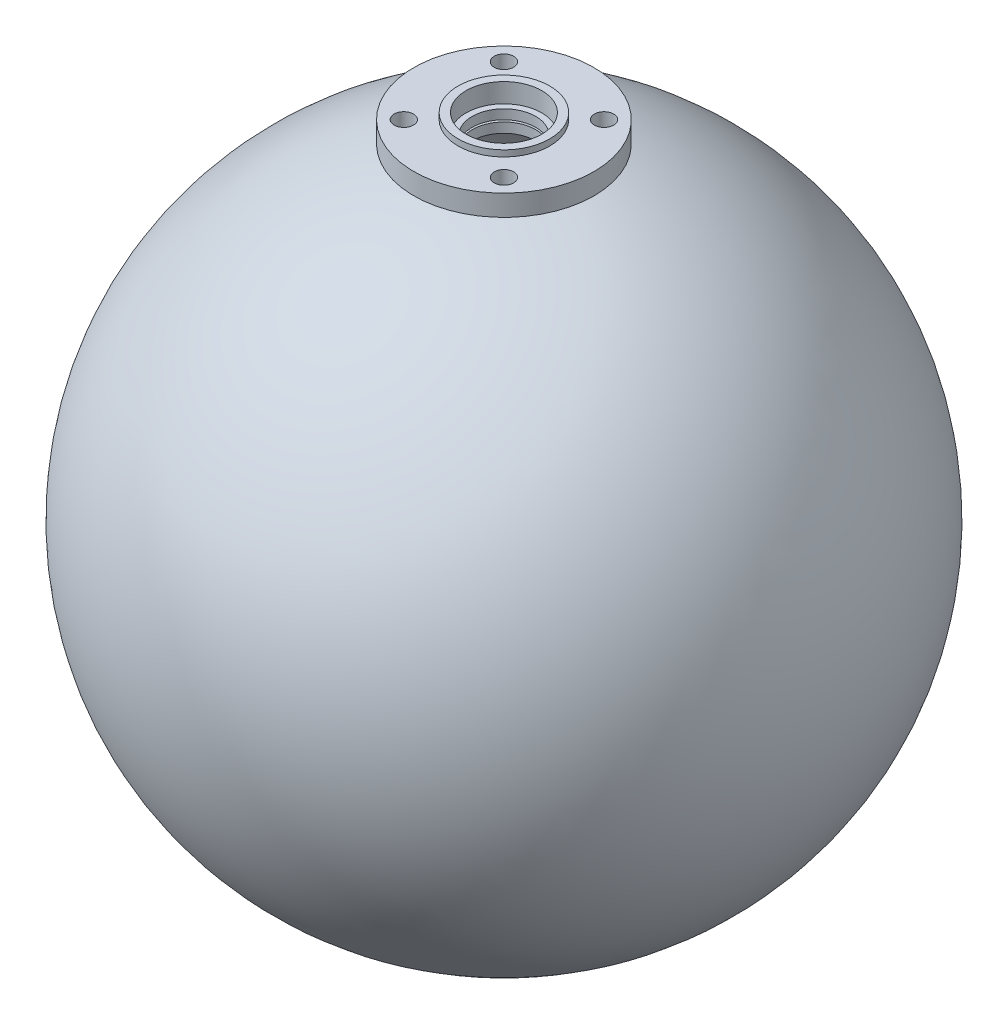
ISO-10303-21;
HEADER;
FILE_DESCRIPTION(('STEP AP214'),'2;1');
FILE_NAME('part.step','',(''),(''),'','','');
FILE_SCHEMA(('AUTOMOTIVE_DESIGN { 1 0 10303 214 1 1 1 1 }'));
ENDSEC;
DATA;
#1=APPLICATION_CONTEXT('core data for automotive mechanical design processes');
#2=APPLICATION_PROTOCOL_DEFINITION('international standard','automotive_design',2000,#1);
#3=PRODUCT_CONTEXT('',#1,'mechanical');
#4=PRODUCT('Part','Part','',(#3));
#5=PRODUCT_RELATED_PRODUCT_CATEGORY('part','',(#4));
#6=PRODUCT_DEFINITION_FORMATION('','',#4);
#7=PRODUCT_DEFINITION_CONTEXT('part definition',#1,'design');
#8=PRODUCT_DEFINITION('design','',#6,#7);
#9=PRODUCT_DEFINITION_SHAPE('','',#8);
#10=(LENGTH_UNIT() NAMED_UNIT(*) SI_UNIT(.MILLI.,.METRE.));
#11=(NAMED_UNIT(*) PLANE_ANGLE_UNIT() SI_UNIT($,.RADIAN.));
#12=(NAMED_UNIT(*) SI_UNIT($,.STERADIAN.) SOLID_ANGLE_UNIT());
#13=UNCERTAINTY_MEASURE_WITH_UNIT(LENGTH_MEASURE(1.E-05),#10,'distance_accuracy_value','');
#14=(GEOMETRIC_REPRESENTATION_CONTEXT(3) GLOBAL_UNCERTAINTY_ASSIGNED_CONTEXT((#13)) GLOBAL_UNIT_ASSIGNED_CONTEXT((#10,
#11,#12)) REPRESENTATION_CONTEXT('',''));
#15=CARTESIAN_POINT('',(0.,0.,0.));
#16=DIRECTION('',(0.,0.,1.));
#17=DIRECTION('',(1.,0.,0.));
#18=AXIS2_PLACEMENT_3D('',#15,#16,#17);
#19=CARTESIAN_POINT('',(0.,348.280834256573,0.));
#20=DIRECTION('',(0.,-1.,0.));
#21=DIRECTION('',(1.,0.,0.));
#22=AXIS2_PLACEMENT_3D('',#19,#20,#21);
#23=CYLINDRICAL_SURFACE('',#22,31.369);
#24=CARTESIAN_POINT('',(0.,319.832834256573,0.));
#25=DIRECTION('',(0.,-1.,0.));
#26=DIRECTION('',(1.,0.,0.));
#27=AXIS2_PLACEMENT_3D('',#24,#25,#26);
#28=CIRCLE('',#27,31.369);
#29=CARTESIAN_POINT('',(31.369,319.832834256573,0.));
#30=VERTEX_POINT('',#29);
#31=EDGE_CURVE('E158',#30,#30,#28,.T.);
#32=ORIENTED_EDGE('',*,*,#31,.T.);
#33=EDGE_LOOP('',(#32));
#34=FACE_BOUND('',#33,.T.);
#35=CARTESIAN_POINT('',(0.,329.230834256573,0.));
#36=DIRECTION('',(0.,1.,0.));
#37=DIRECTION('',(-1.,0.,0.));
#38=AXIS2_PLACEMENT_3D('',#35,#36,#37);
#39=CIRCLE('',#38,31.369);
#40=CARTESIAN_POINT('',(-31.369,329.230834256573,0.));
#41=VERTEX_POINT('',#40);
#42=EDGE_CURVE('E45',#41,#41,#39,.F.);
#43=ORIENTED_EDGE('',*,*,#42,.F.);
#44=EDGE_LOOP('',(#43));
#45=FACE_BOUND('',#44,.T.);
#46=ADVANCED_FACE('F41',(#34,#45),#23,.F.);
#47=CARTESIAN_POINT('',(0.,348.280834256573,0.));
#48=DIRECTION('',(0.,-1.,0.));
#49=DIRECTION('',(1.,0.,0.));
#50=AXIS2_PLACEMENT_3D('',#47,#48,#49);
#51=CYLINDRICAL_SURFACE('',#50,45.212);
#52=CARTESIAN_POINT('',(0.,321.420334256573,0.));
#53=DIRECTION('',(0.,-1.,0.));
#54=DIRECTION('',(1.,0.,0.));
#55=AXIS2_PLACEMENT_3D('',#52,#53,#54);
#56=CIRCLE('',#55,45.212);
#57=CARTESIAN_POINT('',(45.212,321.420334256573,0.));
#58=VERTEX_POINT('',#57);
#59=EDGE_CURVE('E11',#58,#58,#56,.F.);
#60=ORIENTED_EDGE('',*,*,#59,.F.);
#61=EDGE_LOOP('',(#60));
#62=FACE_BOUND('',#61,.T.);
#63=CARTESIAN_POINT('',(0.,319.832834256573,0.));
#64=DIRECTION('',(0.,-1.,0.));
#65=DIRECTION('',(1.,0.,0.));
#66=AXIS2_PLACEMENT_3D('',#63,#64,#65);
#67=CIRCLE('',#66,45.212);
#68=CARTESIAN_POINT('',(45.212,319.832834256573,0.));
#69=VERTEX_POINT('',#68);
#70=EDGE_CURVE('E54',#69,#69,#67,.T.);
#71=ORIENTED_EDGE('',*,*,#70,.F.);
#72=EDGE_LOOP('',(#71));
#73=FACE_BOUND('',#72,.T.);
#74=ADVANCED_FACE('F43',(#62,#73),#51,.T.);
#75=CARTESIAN_POINT('',(0.,319.832834256573,0.));
#76=DIRECTION('',(0.,-1.,0.));
#77=DIRECTION('',(1.,0.,0.));
#78=AXIS2_PLACEMENT_3D('',#75,#76,#77);
#79=PLANE('',#78);
#80=ORIENTED_EDGE('',*,*,#31,.F.);
#81=EDGE_LOOP('',(#80));
#82=FACE_BOUND('',#81,.T.);
#83=ORIENTED_EDGE('',*,*,#70,.T.);
#84=EDGE_LOOP('',(#83));
#85=FACE_BOUND('',#84,.T.);
#86=ADVANCED_FACE('F99',(#82,#85),#79,.T.);
#87=CARTESIAN_POINT('',(0.,593.632005646509,0.));
#88=DIRECTION('',(0.,-1.,0.));
#89=DIRECTION('',(1.,0.,0.));
#90=AXIS2_PLACEMENT_3D('',#87,#88,#89);
#91=CYLINDRICAL_SURFACE('',#90,88.9);
#92=CARTESIAN_POINT('',(0.,342.184834256573,0.));
#93=DIRECTION('',(0.,-1.,0.));
#94=DIRECTION('',(1.,0.,0.));
#95=AXIS2_PLACEMENT_3D('',#92,#93,#94);
#96=CIRCLE('',#95,88.9);
#97=CARTESIAN_POINT('',(88.9,342.184834256573,0.));
#98=VERTEX_POINT('',#97);
#99=EDGE_CURVE('E66',#98,#98,#96,.F.);
#100=ORIENTED_EDGE('',*,*,#99,.F.);
#101=EDGE_LOOP('',(#100));
#102=FACE_BOUND('',#101,.T.);
#103=CARTESIAN_POINT('',(0.,321.420334256573,0.));
#104=DIRECTION('',(0.,-1.,0.));
#105=DIRECTION('',(1.,0.,0.));
#106=AXIS2_PLACEMENT_3D('',#103,#104,#105);
#107=CIRCLE('',#106,88.9);
#108=CARTESIAN_POINT('',(88.9,321.420334256573,0.));
#109=VERTEX_POINT('',#108);
#110=EDGE_CURVE('E61',#109,#109,#107,.T.);
#111=ORIENTED_EDGE('',*,*,#110,.F.);
#112=EDGE_LOOP('',(#111));
#113=FACE_BOUND('',#112,.T.);
#114=ADVANCED_FACE('F96',(#102,#113),#91,.T.);
#115=CARTESIAN_POINT('',(0.,321.420334256573,0.));
#116=DIRECTION('',(0.,-1.,0.));
#117=DIRECTION('',(1.,0.,0.));
#118=AXIS2_PLACEMENT_3D('',#115,#116,#117);
#119=PLANE('',#118);
#120=CARTESIAN_POINT('',(49.3914086658808,321.420334256573,-49.3914086658799));
#121=DIRECTION('',(0.,-1.,0.));
#122=DIRECTION('',(0.,0.,-1.));
#123=AXIS2_PLACEMENT_3D('',#120,#121,#122);
#124=CIRCLE('',#123,9.52499999999999);
#125=CARTESIAN_POINT('',(49.3914086658809,321.420334256573,-58.9164086658799));
#126=VERTEX_POINT('',#125);
#127=EDGE_CURVE('E159',#126,#126,#124,.T.);
#128=ORIENTED_EDGE('',*,*,#127,.F.);
#129=EDGE_LOOP('',(#128));
#130=FACE_BOUND('',#129,.T.);
#131=CARTESIAN_POINT('',(-49.3914086658801,321.420334256573,-49.3914086658806));
#132=DIRECTION('',(0.,-1.,0.));
#133=DIRECTION('',(-1.,0.,0.));
#134=AXIS2_PLACEMENT_3D('',#131,#132,#133);
#135=CIRCLE('',#134,9.52499999999999);
#136=CARTESIAN_POINT('',(-58.9164086658801,321.420334256573,-49.3914086658807));
#137=VERTEX_POINT('',#136);
#138=EDGE_CURVE('E172',#137,#137,#135,.T.);
#139=ORIENTED_EDGE('',*,*,#138,.F.);
#140=EDGE_LOOP('',(#139));
#141=FACE_BOUND('',#140,.T.);
#142=CARTESIAN_POINT('',(-49.3914086658804,321.420334256573,49.3914086658803));
#143=DIRECTION('',(0.,-1.,0.));
#144=DIRECTION('',(0.,0.,1.));
#145=AXIS2_PLACEMENT_3D('',#142,#143,#144);
#146=CIRCLE('',#145,9.52499999999999);
#147=CARTESIAN_POINT('',(-49.3914086658805,321.420334256573,58.9164086658803));
#148=VERTEX_POINT('',#147);
#149=EDGE_CURVE('E74',#148,#148,#146,.T.);
#150=ORIENTED_EDGE('',*,*,#149,.F.);
#151=EDGE_LOOP('',(#150));
#152=FACE_BOUND('',#151,.T.);
#153=CARTESIAN_POINT('',(49.3914086658804,321.420334256573,49.3914086658803));
#154=DIRECTION('',(0.,-1.,0.));
#155=DIRECTION('',(1.,0.,0.));
#156=AXIS2_PLACEMENT_3D('',#153,#154,#155);
#157=CIRCLE('',#156,9.52499999999999);
#158=CARTESIAN_POINT('',(58.9164086658804,321.420334256573,49.3914086658803));
#159=VERTEX_POINT('',#158);
#160=EDGE_CURVE('E62',#159,#159,#157,.T.);
#161=ORIENTED_EDGE('',*,*,#160,.F.);
#162=EDGE_LOOP('',(#161));
#163=FACE_BOUND('',#162,.T.);
#164=ORIENTED_EDGE('',*,*,#59,.T.);
#165=EDGE_LOOP('',(#164));
#166=FACE_BOUND('',#165,.T.);
#167=ORIENTED_EDGE('',*,*,#110,.T.);
#168=EDGE_LOOP('',(#167));
#169=FACE_BOUND('',#168,.T.);
#170=ADVANCED_FACE('F91',(#130,#141,#152,#163,#166,#169),#119,.T.);
#171=CARTESIAN_POINT('',(0.,342.184834256573,0.));
#172=DIRECTION('',(0.,-1.,0.));
#173=DIRECTION('',(1.,0.,0.));
#174=AXIS2_PLACEMENT_3D('',#171,#172,#173);
#175=PLANE('',#174);
#176=CARTESIAN_POINT('',(49.3914086658808,342.184834256573,-49.3914086658799));
#177=DIRECTION('',(0.,-1.,0.));
#178=DIRECTION('',(0.,0.,-1.));
#179=AXIS2_PLACEMENT_3D('',#176,#177,#178);
#180=CIRCLE('',#179,9.52499999999999);
#181=CARTESIAN_POINT('',(49.3914086658809,342.184834256573,-58.9164086658799));
#182=VERTEX_POINT('',#181);
#183=EDGE_CURVE('E162',#182,#182,#180,.T.);
#184=ORIENTED_EDGE('',*,*,#183,.T.);
#185=EDGE_LOOP('',(#184));
#186=FACE_BOUND('',#185,.T.);
#187=CARTESIAN_POINT('',(-49.3914086658801,342.184834256573,-49.3914086658806));
#188=DIRECTION('',(0.,-1.,0.));
#189=DIRECTION('',(-1.,0.,0.));
#190=AXIS2_PLACEMENT_3D('',#187,#188,#189);
#191=CIRCLE('',#190,9.52499999999999);
#192=CARTESIAN_POINT('',(-58.9164086658801,342.184834256573,-49.3914086658807));
#193=VERTEX_POINT('',#192);
#194=EDGE_CURVE('E175',#193,#193,#191,.T.);
#195=ORIENTED_EDGE('',*,*,#194,.T.);
#196=EDGE_LOOP('',(#195));
#197=FACE_BOUND('',#196,.T.);
#198=CARTESIAN_POINT('',(-49.3914086658804,342.184834256573,49.3914086658803));
#199=DIRECTION('',(0.,-1.,0.));
#200=DIRECTION('',(0.,0.,1.));
#201=AXIS2_PLACEMENT_3D('',#198,#199,#200);
#202=CIRCLE('',#201,9.52499999999999);
#203=CARTESIAN_POINT('',(-49.3914086658805,342.184834256573,58.9164086658803));
#204=VERTEX_POINT('',#203);
#205=EDGE_CURVE('E69',#204,#204,#202,.T.);
#206=ORIENTED_EDGE('',*,*,#205,.T.);
#207=EDGE_LOOP('',(#206));
#208=FACE_BOUND('',#207,.T.);
#209=CARTESIAN_POINT('',(49.3914086658804,342.184834256573,49.3914086658803));
#210=DIRECTION('',(0.,-1.,0.));
#211=DIRECTION('',(1.,0.,0.));
#212=AXIS2_PLACEMENT_3D('',#209,#210,#211);
#213=CIRCLE('',#212,9.52499999999999);
#214=CARTESIAN_POINT('',(58.9164086658804,342.184834256573,49.3914086658803));
#215=VERTEX_POINT('',#214);
#216=EDGE_CURVE('E59',#215,#215,#213,.T.);
#217=ORIENTED_EDGE('',*,*,#216,.T.);
#218=EDGE_LOOP('',(#217));
#219=FACE_BOUND('',#218,.T.);
#220=CARTESIAN_POINT('',(0.,342.184834256573,0.));
#221=DIRECTION('',(0.,-1.,0.));
#222=DIRECTION('',(1.,0.,0.));
#223=AXIS2_PLACEMENT_3D('',#220,#221,#222);
#224=CIRCLE('',#223,45.212);
#225=CARTESIAN_POINT('',(45.212,342.184834256573,0.));
#226=VERTEX_POINT('',#225);
#227=EDGE_CURVE('E57',#226,#226,#224,.F.);
#228=ORIENTED_EDGE('',*,*,#227,.F.);
#229=EDGE_LOOP('',(#228));
#230=FACE_BOUND('',#229,.T.);
#231=ORIENTED_EDGE('',*,*,#99,.T.);
#232=EDGE_LOOP('',(#231));
#233=FACE_BOUND('',#232,.T.);
#234=ADVANCED_FACE('F87',(#186,#197,#208,#219,#230,#233),#175,.F.);
#235=CARTESIAN_POINT('',(0.,348.280834256573,0.));
#236=DIRECTION('',(0.,-1.,0.));
#237=DIRECTION('',(1.,0.,0.));
#238=AXIS2_PLACEMENT_3D('',#235,#236,#237);
#239=PLANE('',#238);
#240=CARTESIAN_POINT('',(0.,348.280834256573,0.));
#241=DIRECTION('',(0.,1.,0.));
#242=DIRECTION('',(-1.,0.,0.));
#243=AXIS2_PLACEMENT_3D('',#240,#241,#242);
#244=CIRCLE('',#243,37.338);
#245=CARTESIAN_POINT('',(-37.338,348.280834256573,0.));
#246=VERTEX_POINT('',#245);
#247=EDGE_CURVE('E167',#246,#246,#244,.T.);
#248=ORIENTED_EDGE('',*,*,#247,.F.);
#249=EDGE_LOOP('',(#248));
#250=FACE_BOUND('',#249,.T.);
#251=CARTESIAN_POINT('',(0.,348.280834256573,0.));
#252=DIRECTION('',(0.,-1.,0.));
#253=DIRECTION('',(1.,0.,0.));
#254=AXIS2_PLACEMENT_3D('',#251,#252,#253);
#255=CIRCLE('',#254,45.212);
#256=CARTESIAN_POINT('',(45.212,348.280834256573,0.));
#257=VERTEX_POINT('',#256);
#258=EDGE_CURVE('E49',#257,#257,#255,.T.);
#259=ORIENTED_EDGE('',*,*,#258,.F.);
#260=EDGE_LOOP('',(#259));
#261=FACE_BOUND('',#260,.T.);
#262=ADVANCED_FACE('F90',(#250,#261),#239,.F.);
#263=ORIENTED_EDGE('',*,*,#258,.T.);
#264=EDGE_LOOP('',(#263));
#265=FACE_BOUND('',#264,.T.);
#266=ORIENTED_EDGE('',*,*,#227,.T.);
#267=EDGE_LOOP('',(#266));
#268=FACE_BOUND('',#267,.T.);
#269=ADVANCED_FACE('F85',(#265,#268),#51,.T.);
#270=CARTESIAN_POINT('',(49.3914086658804,348.280834256573,49.3914086658803));
#271=DIRECTION('',(0.,-1.,0.));
#272=DIRECTION('',(1.,0.,0.));
#273=AXIS2_PLACEMENT_3D('',#270,#271,#272);
#274=CYLINDRICAL_SURFACE('',#273,9.52499999999999);
#275=CARTESIAN_POINT('',(58.9164086658804,321.420334256573,49.3914086658803));
#276=CARTESIAN_POINT('',(58.9164086658804,321.636631131573,49.3914086658803));
#277=CARTESIAN_POINT('',(58.9164086658804,321.852928006573,49.3914086658803));
#278=CARTESIAN_POINT('',(58.9164086658804,322.285521756573,49.3914086658803));
#279=CARTESIAN_POINT('',(58.9164086658804,322.501818631573,49.3914086658803));
#280=CARTESIAN_POINT('',(58.9164086658804,322.934412381573,49.3914086658803));
#281=CARTESIAN_POINT('',(58.9164086658804,323.150709256573,49.3914086658803));
#282=CARTESIAN_POINT('',(58.9164086658804,323.583303006573,49.3914086658803));
#283=CARTESIAN_POINT('',(58.9164086658804,323.799599881573,49.3914086658803));
#284=CARTESIAN_POINT('',(58.9164086658804,324.232193631573,49.3914086658803));
#285=CARTESIAN_POINT('',(58.9164086658804,324.448490506573,49.3914086658803));
#286=CARTESIAN_POINT('',(58.9164086658804,324.881084256573,49.3914086658803));
#287=CARTESIAN_POINT('',(58.9164086658804,325.097381131573,49.3914086658803));
#288=CARTESIAN_POINT('',(58.9164086658804,325.529974881573,49.3914086658803));
#289=CARTESIAN_POINT('',(58.9164086658804,325.746271756573,49.3914086658803));
#290=CARTESIAN_POINT('',(58.9164086658804,326.178865506573,49.3914086658803));
#291=CARTESIAN_POINT('',(58.9164086658804,326.395162381573,49.3914086658803));
#292=CARTESIAN_POINT('',(58.9164086658804,326.827756131573,49.3914086658803));
#293=CARTESIAN_POINT('',(58.9164086658804,327.044053006573,49.3914086658803));
#294=CARTESIAN_POINT('',(58.9164086658804,327.476646756573,49.3914086658803));
#295=CARTESIAN_POINT('',(58.9164086658804,327.692943631573,49.3914086658803));
#296=CARTESIAN_POINT('',(58.9164086658804,328.125537381573,49.3914086658803));
#297=CARTESIAN_POINT('',(58.9164086658804,328.341834256573,49.3914086658803));
#298=CARTESIAN_POINT('',(58.9164086658804,328.774428006573,49.3914086658803));
#299=CARTESIAN_POINT('',(58.9164086658804,328.990724881573,49.3914086658803));
#300=CARTESIAN_POINT('',(58.9164086658804,329.423318631573,49.3914086658803));
#301=CARTESIAN_POINT('',(58.9164086658804,329.639615506573,49.3914086658803));
#302=CARTESIAN_POINT('',(58.9164086658804,330.072209256573,49.3914086658803));
#303=CARTESIAN_POINT('',(58.9164086658804,330.288506131573,49.3914086658803));
#304=CARTESIAN_POINT('',(58.9164086658804,330.721099881573,49.3914086658803));
#305=CARTESIAN_POINT('',(58.9164086658804,330.937396756573,49.3914086658803));
#306=CARTESIAN_POINT('',(58.9164086658804,331.369990506573,49.3914086658803));
#307=CARTESIAN_POINT('',(58.9164086658804,331.586287381573,49.3914086658803));
#308=CARTESIAN_POINT('',(58.9164086658804,332.018881131573,49.3914086658803));
#309=CARTESIAN_POINT('',(58.9164086658804,332.235178006573,49.3914086658803));
#310=CARTESIAN_POINT('',(58.9164086658804,332.667771756573,49.3914086658803));
#311=CARTESIAN_POINT('',(58.9164086658804,332.884068631573,49.3914086658803));
#312=CARTESIAN_POINT('',(58.9164086658804,333.316662381573,49.3914086658803));
#313=CARTESIAN_POINT('',(58.9164086658804,333.532959256573,49.3914086658803));
#314=CARTESIAN_POINT('',(58.9164086658804,333.965553006573,49.3914086658803));
#315=CARTESIAN_POINT('',(58.9164086658804,334.181849881573,49.3914086658803));
#316=CARTESIAN_POINT('',(58.9164086658804,334.614443631573,49.3914086658803));
#317=CARTESIAN_POINT('',(58.9164086658804,334.830740506573,49.3914086658803));
#318=CARTESIAN_POINT('',(58.9164086658804,335.263334256573,49.3914086658803));
#319=CARTESIAN_POINT('',(58.9164086658804,335.479631131573,49.3914086658803));
#320=CARTESIAN_POINT('',(58.9164086658804,335.912224881573,49.3914086658803));
#321=CARTESIAN_POINT('',(58.9164086658804,336.128521756573,49.3914086658803));
#322=CARTESIAN_POINT('',(58.9164086658804,336.561115506573,49.3914086658803));
#323=CARTESIAN_POINT('',(58.9164086658804,336.777412381573,49.3914086658803));
#324=CARTESIAN_POINT('',(58.9164086658804,337.210006131573,49.3914086658803));
#325=CARTESIAN_POINT('',(58.9164086658804,337.426303006573,49.3914086658803));
#326=CARTESIAN_POINT('',(58.9164086658804,337.858896756573,49.3914086658803));
#327=CARTESIAN_POINT('',(58.9164086658804,338.075193631573,49.3914086658803));
#328=CARTESIAN_POINT('',(58.9164086658804,338.507787381573,49.3914086658803));
#329=CARTESIAN_POINT('',(58.9164086658804,338.724084256573,49.3914086658803));
#330=CARTESIAN_POINT('',(58.9164086658804,339.156678006573,49.3914086658803));
#331=CARTESIAN_POINT('',(58.9164086658804,339.372974881573,49.3914086658803));
#332=CARTESIAN_POINT('',(58.9164086658804,339.805568631573,49.3914086658803));
#333=CARTESIAN_POINT('',(58.9164086658804,340.021865506573,49.3914086658803));
#334=CARTESIAN_POINT('',(58.9164086658804,340.454459256573,49.3914086658803));
#335=CARTESIAN_POINT('',(58.9164086658804,340.670756131573,49.3914086658803));
#336=CARTESIAN_POINT('',(58.9164086658804,341.103349881573,49.3914086658803));
#337=CARTESIAN_POINT('',(58.9164086658804,341.319646756573,49.3914086658803));
#338=CARTESIAN_POINT('',(58.9164086658804,341.752240506573,49.3914086658803));
#339=CARTESIAN_POINT('',(58.9164086658804,341.968537381573,49.3914086658803));
#340=CARTESIAN_POINT('',(58.9164086658804,342.184834256573,49.3914086658803));
#341=B_SPLINE_CURVE_WITH_KNOTS('',3,(#275,#276,#277,#278,#279,#280,#281,#282,#283,#284,#285,
#286,#287,#288,#289,#290,#291,#292,#293,#294,#295,#296,#297,#298,#299,#300,#301,#302,#303,#304,
#305,#306,#307,#308,#309,#310,#311,#312,#313,#314,#315,#316,#317,#318,#319,#320,#321,#322,#323,
#324,#325,#326,#327,#328,#329,#330,#331,#332,#333,#334,#335,#336,#337,#338,#339,#340),
.UNSPECIFIED.,.F.,.F.,(4,2,2,2,2,2,2,2,2,2,2,2,2,2,2,2,2,2,2,2,2,2,2,2,2,2,2,2,2,2,2,2,4),(0.,
0.648890624999954,1.29778124999996,1.94667187499997,2.59556249999998,3.24445312499999,
3.89334375,4.54223437499995,5.19112499999996,5.84001562499997,6.48890624999998,7.13779687499999,
7.7866875,8.43557812500001,9.08446874999996,9.73335937499997,10.38225,11.031140625,11.68003125,
12.328921875,12.9778125,13.626703125,14.27559375,14.924484375,15.573375,16.222265625,
16.87115625,17.520046875,18.1689375,18.817828125,19.46671875,20.115609375,20.7645),.UNSPECIFIED.);
#342=EDGE_CURVE('BSEAM135',#159,#215,#341,.T.);
#343=ORIENTED_EDGE('',*,*,#160,.T.);
#344=ORIENTED_EDGE('',*,*,#216,.F.);
#345=ORIENTED_EDGE('',*,*,#342,.T.);
#346=ORIENTED_EDGE('',*,*,#342,.F.);
#347=EDGE_LOOP('',(#343,#345,#344,#346));
#348=FACE_BOUND('',#347,.T.);
#349=ADVANCED_FACE('F135',(#348),#274,.F.);
#350=CARTESIAN_POINT('',(-49.3914086658804,348.280834256573,49.3914086658803));
#351=DIRECTION('',(0.,-1.,0.));
#352=DIRECTION('',(0.,0.,1.));
#353=AXIS2_PLACEMENT_3D('',#350,#351,#352);
#354=CYLINDRICAL_SURFACE('',#353,9.52499999999999);
#355=CARTESIAN_POINT('',(-49.3914086658805,321.420334256573,58.9164086658803));
#356=CARTESIAN_POINT('',(-49.3914086658805,321.636631131573,58.9164086658803));
#357=CARTESIAN_POINT('',(-49.3914086658805,321.852928006573,58.9164086658803));
#358=CARTESIAN_POINT('',(-49.3914086658805,322.285521756573,58.9164086658803));
#359=CARTESIAN_POINT('',(-49.3914086658805,322.501818631573,58.9164086658803));
#360=CARTESIAN_POINT('',(-49.3914086658805,322.934412381573,58.9164086658803));
#361=CARTESIAN_POINT('',(-49.3914086658805,323.150709256573,58.9164086658803));
#362=CARTESIAN_POINT('',(-49.3914086658805,323.583303006573,58.9164086658803));
#363=CARTESIAN_POINT('',(-49.3914086658805,323.799599881573,58.9164086658803));
#364=CARTESIAN_POINT('',(-49.3914086658805,324.232193631573,58.9164086658803));
#365=CARTESIAN_POINT('',(-49.3914086658805,324.448490506573,58.9164086658803));
#366=CARTESIAN_POINT('',(-49.3914086658805,324.881084256573,58.9164086658803));
#367=CARTESIAN_POINT('',(-49.3914086658805,325.097381131573,58.9164086658803));
#368=CARTESIAN_POINT('',(-49.3914086658805,325.529974881573,58.9164086658803));
#369=CARTESIAN_POINT('',(-49.3914086658805,325.746271756573,58.9164086658803));
#370=CARTESIAN_POINT('',(-49.3914086658805,326.178865506573,58.9164086658803));
#371=CARTESIAN_POINT('',(-49.3914086658805,326.395162381573,58.9164086658803));
#372=CARTESIAN_POINT('',(-49.3914086658805,326.827756131573,58.9164086658803));
#373=CARTESIAN_POINT('',(-49.3914086658805,327.044053006573,58.9164086658803));
#374=CARTESIAN_POINT('',(-49.3914086658805,327.476646756573,58.9164086658803));
#375=CARTESIAN_POINT('',(-49.3914086658805,327.692943631573,58.9164086658803));
#376=CARTESIAN_POINT('',(-49.3914086658805,328.125537381573,58.9164086658803));
#377=CARTESIAN_POINT('',(-49.3914086658805,328.341834256573,58.9164086658803));
#378=CARTESIAN_POINT('',(-49.3914086658805,328.774428006573,58.9164086658803));
#379=CARTESIAN_POINT('',(-49.3914086658805,328.990724881573,58.9164086658803));
#380=CARTESIAN_POINT('',(-49.3914086658805,329.423318631573,58.9164086658803));
#381=CARTESIAN_POINT('',(-49.3914086658805,329.639615506573,58.9164086658803));
#382=CARTESIAN_POINT('',(-49.3914086658805,330.072209256573,58.9164086658803));
#383=CARTESIAN_POINT('',(-49.3914086658805,330.288506131573,58.9164086658803));
#384=CARTESIAN_POINT('',(-49.3914086658805,330.721099881573,58.9164086658803));
#385=CARTESIAN_POINT('',(-49.3914086658805,330.937396756573,58.9164086658803));
#386=CARTESIAN_POINT('',(-49.3914086658805,331.369990506573,58.9164086658803));
#387=CARTESIAN_POINT('',(-49.3914086658805,331.586287381573,58.9164086658803));
#388=CARTESIAN_POINT('',(-49.3914086658805,332.018881131573,58.9164086658803));
#389=CARTESIAN_POINT('',(-49.3914086658805,332.235178006573,58.9164086658803));
#390=CARTESIAN_POINT('',(-49.3914086658805,332.667771756573,58.9164086658803));
#391=CARTESIAN_POINT('',(-49.3914086658805,332.884068631573,58.9164086658803));
#392=CARTESIAN_POINT('',(-49.3914086658805,333.316662381573,58.9164086658803));
#393=CARTESIAN_POINT('',(-49.3914086658805,333.532959256573,58.9164086658803));
#394=CARTESIAN_POINT('',(-49.3914086658805,333.965553006573,58.9164086658803));
#395=CARTESIAN_POINT('',(-49.3914086658805,334.181849881573,58.9164086658803));
#396=CARTESIAN_POINT('',(-49.3914086658805,334.614443631573,58.9164086658803));
#397=CARTESIAN_POINT('',(-49.3914086658805,334.830740506573,58.9164086658803));
#398=CARTESIAN_POINT('',(-49.3914086658805,335.263334256573,58.9164086658803));
#399=CARTESIAN_POINT('',(-49.3914086658805,335.479631131573,58.9164086658803));
#400=CARTESIAN_POINT('',(-49.3914086658805,335.912224881573,58.9164086658803));
#401=CARTESIAN_POINT('',(-49.3914086658805,336.128521756573,58.9164086658803));
#402=CARTESIAN_POINT('',(-49.3914086658805,336.561115506573,58.9164086658803));
#403=CARTESIAN_POINT('',(-49.3914086658805,336.777412381573,58.9164086658803));
#404=CARTESIAN_POINT('',(-49.3914086658805,337.210006131573,58.9164086658803));
#405=CARTESIAN_POINT('',(-49.3914086658805,337.426303006573,58.9164086658803));
#406=CARTESIAN_POINT('',(-49.3914086658805,337.858896756573,58.9164086658803));
#407=CARTESIAN_POINT('',(-49.3914086658805,338.075193631573,58.9164086658803));
#408=CARTESIAN_POINT('',(-49.3914086658805,338.507787381573,58.9164086658803));
#409=CARTESIAN_POINT('',(-49.3914086658805,338.724084256573,58.9164086658803));
#410=CARTESIAN_POINT('',(-49.3914086658805,339.156678006573,58.9164086658803));
#411=CARTESIAN_POINT('',(-49.3914086658805,339.372974881573,58.9164086658803));
#412=CARTESIAN_POINT('',(-49.3914086658805,339.805568631573,58.9164086658803));
#413=CARTESIAN_POINT('',(-49.3914086658805,340.021865506573,58.9164086658803));
#414=CARTESIAN_POINT('',(-49.3914086658805,340.454459256573,58.9164086658803));
#415=CARTESIAN_POINT('',(-49.3914086658805,340.670756131573,58.9164086658803));
#416=CARTESIAN_POINT('',(-49.3914086658805,341.103349881573,58.9164086658803));
#417=CARTESIAN_POINT('',(-49.3914086658805,341.319646756573,58.9164086658803));
#418=CARTESIAN_POINT('',(-49.3914086658805,341.752240506573,58.9164086658803));
#419=CARTESIAN_POINT('',(-49.3914086658805,341.968537381573,58.9164086658803));
#420=CARTESIAN_POINT('',(-49.3914086658805,342.184834256573,58.9164086658803));
#421=B_SPLINE_CURVE_WITH_KNOTS('',3,(#355,#356,#357,#358,#359,#360,#361,#362,#363,#364,#365,
#366,#367,#368,#369,#370,#371,#372,#373,#374,#375,#376,#377,#378,#379,#380,#381,#382,#383,#384,
#385,#386,#387,#388,#389,#390,#391,#392,#393,#394,#395,#396,#397,#398,#399,#400,#401,#402,#403,
#404,#405,#406,#407,#408,#409,#410,#411,#412,#413,#414,#415,#416,#417,#418,#419,#420),
.UNSPECIFIED.,.F.,.F.,(4,2,2,2,2,2,2,2,2,2,2,2,2,2,2,2,2,2,2,2,2,2,2,2,2,2,2,2,2,2,2,2,4),(0.,
0.648890624999954,1.29778124999996,1.94667187499997,2.59556249999998,3.24445312499999,
3.89334375,4.54223437499995,5.19112499999996,5.84001562499997,6.48890624999998,7.13779687499999,
7.7866875,8.43557812500001,9.08446874999996,9.73335937499997,10.38225,11.031140625,11.68003125,
12.328921875,12.9778125,13.626703125,14.27559375,14.924484375,15.573375,16.222265625,
16.87115625,17.520046875,18.1689375,18.817828125,19.46671875,20.115609375,20.7645),.UNSPECIFIED.);
#422=EDGE_CURVE('BSEAM131',#148,#204,#421,.T.);
#423=ORIENTED_EDGE('',*,*,#149,.T.);
#424=ORIENTED_EDGE('',*,*,#205,.F.);
#425=ORIENTED_EDGE('',*,*,#422,.T.);
#426=ORIENTED_EDGE('',*,*,#422,.F.);
#427=EDGE_LOOP('',(#423,#425,#424,#426));
#428=FACE_BOUND('',#427,.T.);
#429=ADVANCED_FACE('F131',(#428),#354,.F.);
#430=CARTESIAN_POINT('',(-49.3914086658801,348.280834256573,-49.3914086658806));
#431=DIRECTION('',(0.,-1.,0.));
#432=DIRECTION('',(-1.,0.,0.));
#433=AXIS2_PLACEMENT_3D('',#430,#431,#432);
#434=CYLINDRICAL_SURFACE('',#433,9.52499999999999);
#435=CARTESIAN_POINT('',(-58.9164086658801,321.420334256573,-49.3914086658807));
#436=CARTESIAN_POINT('',(-58.9164086658801,321.636631131573,-49.3914086658807));
#437=CARTESIAN_POINT('',(-58.9164086658801,321.852928006573,-49.3914086658807));
#438=CARTESIAN_POINT('',(-58.9164086658801,322.285521756573,-49.3914086658807));
#439=CARTESIAN_POINT('',(-58.9164086658801,322.501818631573,-49.3914086658807));
#440=CARTESIAN_POINT('',(-58.9164086658801,322.934412381573,-49.3914086658807));
#441=CARTESIAN_POINT('',(-58.9164086658801,323.150709256573,-49.3914086658807));
#442=CARTESIAN_POINT('',(-58.9164086658801,323.583303006573,-49.3914086658807));
#443=CARTESIAN_POINT('',(-58.9164086658801,323.799599881573,-49.3914086658807));
#444=CARTESIAN_POINT('',(-58.9164086658801,324.232193631573,-49.3914086658807));
#445=CARTESIAN_POINT('',(-58.9164086658801,324.448490506573,-49.3914086658807));
#446=CARTESIAN_POINT('',(-58.9164086658801,324.881084256573,-49.3914086658807));
#447=CARTESIAN_POINT('',(-58.9164086658801,325.097381131573,-49.3914086658807));
#448=CARTESIAN_POINT('',(-58.9164086658801,325.529974881573,-49.3914086658807));
#449=CARTESIAN_POINT('',(-58.9164086658801,325.746271756573,-49.3914086658807));
#450=CARTESIAN_POINT('',(-58.9164086658801,326.178865506573,-49.3914086658807));
#451=CARTESIAN_POINT('',(-58.9164086658801,326.395162381573,-49.3914086658807));
#452=CARTESIAN_POINT('',(-58.9164086658801,326.827756131573,-49.3914086658807));
#453=CARTESIAN_POINT('',(-58.9164086658801,327.044053006573,-49.3914086658807));
#454=CARTESIAN_POINT('',(-58.9164086658801,327.476646756573,-49.3914086658807));
#455=CARTESIAN_POINT('',(-58.9164086658801,327.692943631573,-49.3914086658807));
#456=CARTESIAN_POINT('',(-58.9164086658801,328.125537381573,-49.3914086658807));
#457=CARTESIAN_POINT('',(-58.9164086658801,328.341834256573,-49.3914086658807));
#458=CARTESIAN_POINT('',(-58.9164086658801,328.774428006573,-49.3914086658807));
#459=CARTESIAN_POINT('',(-58.9164086658801,328.990724881573,-49.3914086658807));
#460=CARTESIAN_POINT('',(-58.9164086658801,329.423318631573,-49.3914086658807));
#461=CARTESIAN_POINT('',(-58.9164086658801,329.639615506573,-49.3914086658807));
#462=CARTESIAN_POINT('',(-58.9164086658801,330.072209256573,-49.3914086658807));
#463=CARTESIAN_POINT('',(-58.9164086658801,330.288506131573,-49.3914086658807));
#464=CARTESIAN_POINT('',(-58.9164086658801,330.721099881573,-49.3914086658807));
#465=CARTESIAN_POINT('',(-58.9164086658801,330.937396756573,-49.3914086658807));
#466=CARTESIAN_POINT('',(-58.9164086658801,331.369990506573,-49.3914086658807));
#467=CARTESIAN_POINT('',(-58.9164086658801,331.586287381573,-49.3914086658807));
#468=CARTESIAN_POINT('',(-58.9164086658801,332.018881131573,-49.3914086658807));
#469=CARTESIAN_POINT('',(-58.9164086658801,332.235178006573,-49.3914086658807));
#470=CARTESIAN_POINT('',(-58.9164086658801,332.667771756573,-49.3914086658807));
#471=CARTESIAN_POINT('',(-58.9164086658801,332.884068631573,-49.3914086658807));
#472=CARTESIAN_POINT('',(-58.9164086658801,333.316662381573,-49.3914086658807));
#473=CARTESIAN_POINT('',(-58.9164086658801,333.532959256573,-49.3914086658807));
#474=CARTESIAN_POINT('',(-58.9164086658801,333.965553006573,-49.3914086658807));
#475=CARTESIAN_POINT('',(-58.9164086658801,334.181849881573,-49.3914086658807));
#476=CARTESIAN_POINT('',(-58.9164086658801,334.614443631573,-49.3914086658807));
#477=CARTESIAN_POINT('',(-58.9164086658801,334.830740506573,-49.3914086658807));
#478=CARTESIAN_POINT('',(-58.9164086658801,335.263334256573,-49.3914086658807));
#479=CARTESIAN_POINT('',(-58.9164086658801,335.479631131573,-49.3914086658807));
#480=CARTESIAN_POINT('',(-58.9164086658801,335.912224881573,-49.3914086658807));
#481=CARTESIAN_POINT('',(-58.9164086658801,336.128521756573,-49.3914086658807));
#482=CARTESIAN_POINT('',(-58.9164086658801,336.561115506573,-49.3914086658807));
#483=CARTESIAN_POINT('',(-58.9164086658801,336.777412381573,-49.3914086658807));
#484=CARTESIAN_POINT('',(-58.9164086658801,337.210006131573,-49.3914086658807));
#485=CARTESIAN_POINT('',(-58.9164086658801,337.426303006573,-49.3914086658807));
#486=CARTESIAN_POINT('',(-58.9164086658801,337.858896756573,-49.3914086658807));
#487=CARTESIAN_POINT('',(-58.9164086658801,338.075193631573,-49.3914086658807));
#488=CARTESIAN_POINT('',(-58.9164086658801,338.507787381573,-49.3914086658807));
#489=CARTESIAN_POINT('',(-58.9164086658801,338.724084256573,-49.3914086658807));
#490=CARTESIAN_POINT('',(-58.9164086658801,339.156678006573,-49.3914086658807));
#491=CARTESIAN_POINT('',(-58.9164086658801,339.372974881573,-49.3914086658807));
#492=CARTESIAN_POINT('',(-58.9164086658801,339.805568631573,-49.3914086658807));
#493=CARTESIAN_POINT('',(-58.9164086658801,340.021865506573,-49.3914086658807));
#494=CARTESIAN_POINT('',(-58.9164086658801,340.454459256573,-49.3914086658807));
#495=CARTESIAN_POINT('',(-58.9164086658801,340.670756131573,-49.3914086658807));
#496=CARTESIAN_POINT('',(-58.9164086658801,341.103349881573,-49.3914086658807));
#497=CARTESIAN_POINT('',(-58.9164086658801,341.319646756573,-49.3914086658807));
#498=CARTESIAN_POINT('',(-58.9164086658801,341.752240506573,-49.3914086658807));
#499=CARTESIAN_POINT('',(-58.9164086658801,341.968537381573,-49.3914086658807));
#500=CARTESIAN_POINT('',(-58.9164086658801,342.184834256573,-49.3914086658807));
#501=B_SPLINE_CURVE_WITH_KNOTS('',3,(#435,#436,#437,#438,#439,#440,#441,#442,#443,#444,#445,
#446,#447,#448,#449,#450,#451,#452,#453,#454,#455,#456,#457,#458,#459,#460,#461,#462,#463,#464,
#465,#466,#467,#468,#469,#470,#471,#472,#473,#474,#475,#476,#477,#478,#479,#480,#481,#482,#483,
#484,#485,#486,#487,#488,#489,#490,#491,#492,#493,#494,#495,#496,#497,#498,#499,#500),
.UNSPECIFIED.,.F.,.F.,(4,2,2,2,2,2,2,2,2,2,2,2,2,2,2,2,2,2,2,2,2,2,2,2,2,2,2,2,2,2,2,2,4),(0.,
0.648890624999954,1.29778124999996,1.94667187499997,2.59556249999998,3.24445312499999,
3.89334375,4.54223437499995,5.19112499999996,5.84001562499997,6.48890624999998,7.13779687499999,
7.7866875,8.43557812500001,9.08446874999996,9.73335937499997,10.38225,11.031140625,11.68003125,
12.328921875,12.9778125,13.626703125,14.27559375,14.924484375,15.573375,16.222265625,
16.87115625,17.520046875,18.1689375,18.817828125,19.46671875,20.115609375,20.7645),.UNSPECIFIED.);
#502=EDGE_CURVE('BSEAM127',#137,#193,#501,.T.);
#503=ORIENTED_EDGE('',*,*,#138,.T.);
#504=ORIENTED_EDGE('',*,*,#194,.F.);
#505=ORIENTED_EDGE('',*,*,#502,.T.);
#506=ORIENTED_EDGE('',*,*,#502,.F.);
#507=EDGE_LOOP('',(#503,#505,#504,#506));
#508=FACE_BOUND('',#507,.T.);
#509=ADVANCED_FACE('F127',(#508),#434,.F.);
#510=CARTESIAN_POINT('',(49.3914086658808,348.280834256573,-49.3914086658799));
#511=DIRECTION('',(0.,-1.,0.));
#512=DIRECTION('',(0.,0.,-1.));
#513=AXIS2_PLACEMENT_3D('',#510,#511,#512);
#514=CYLINDRICAL_SURFACE('',#513,9.52499999999999);
#515=CARTESIAN_POINT('',(49.3914086658809,321.420334256573,-58.9164086658799));
#516=CARTESIAN_POINT('',(49.3914086658809,321.636631131573,-58.9164086658799));
#517=CARTESIAN_POINT('',(49.3914086658809,321.852928006573,-58.9164086658799));
#518=CARTESIAN_POINT('',(49.3914086658809,322.285521756573,-58.9164086658799));
#519=CARTESIAN_POINT('',(49.3914086658809,322.501818631573,-58.9164086658799));
#520=CARTESIAN_POINT('',(49.3914086658809,322.934412381573,-58.9164086658799));
#521=CARTESIAN_POINT('',(49.3914086658809,323.150709256573,-58.9164086658799));
#522=CARTESIAN_POINT('',(49.3914086658809,323.583303006573,-58.9164086658799));
#523=CARTESIAN_POINT('',(49.3914086658809,323.799599881573,-58.9164086658799));
#524=CARTESIAN_POINT('',(49.3914086658809,324.232193631573,-58.9164086658799));
#525=CARTESIAN_POINT('',(49.3914086658809,324.448490506573,-58.9164086658799));
#526=CARTESIAN_POINT('',(49.3914086658809,324.881084256573,-58.9164086658799));
#527=CARTESIAN_POINT('',(49.3914086658809,325.097381131573,-58.9164086658799));
#528=CARTESIAN_POINT('',(49.3914086658809,325.529974881573,-58.9164086658799));
#529=CARTESIAN_POINT('',(49.3914086658809,325.746271756573,-58.9164086658799));
#530=CARTESIAN_POINT('',(49.3914086658809,326.178865506573,-58.9164086658799));
#531=CARTESIAN_POINT('',(49.3914086658809,326.395162381573,-58.9164086658799));
#532=CARTESIAN_POINT('',(49.3914086658809,326.827756131573,-58.9164086658799));
#533=CARTESIAN_POINT('',(49.3914086658809,327.044053006573,-58.9164086658799));
#534=CARTESIAN_POINT('',(49.3914086658809,327.476646756573,-58.9164086658799));
#535=CARTESIAN_POINT('',(49.3914086658809,327.692943631573,-58.9164086658799));
#536=CARTESIAN_POINT('',(49.3914086658809,328.125537381573,-58.9164086658799));
#537=CARTESIAN_POINT('',(49.3914086658809,328.341834256573,-58.9164086658799));
#538=CARTESIAN_POINT('',(49.3914086658809,328.774428006573,-58.9164086658799));
#539=CARTESIAN_POINT('',(49.3914086658809,328.990724881573,-58.9164086658799));
#540=CARTESIAN_POINT('',(49.3914086658809,329.423318631573,-58.9164086658799));
#541=CARTESIAN_POINT('',(49.3914086658809,329.639615506573,-58.9164086658799));
#542=CARTESIAN_POINT('',(49.3914086658809,330.072209256573,-58.9164086658799));
#543=CARTESIAN_POINT('',(49.3914086658809,330.288506131573,-58.9164086658799));
#544=CARTESIAN_POINT('',(49.3914086658809,330.721099881573,-58.9164086658799));
#545=CARTESIAN_POINT('',(49.3914086658809,330.937396756573,-58.9164086658799));
#546=CARTESIAN_POINT('',(49.3914086658809,331.369990506573,-58.9164086658799));
#547=CARTESIAN_POINT('',(49.3914086658809,331.586287381573,-58.9164086658799));
#548=CARTESIAN_POINT('',(49.3914086658809,332.018881131573,-58.9164086658799));
#549=CARTESIAN_POINT('',(49.3914086658809,332.235178006573,-58.9164086658799));
#550=CARTESIAN_POINT('',(49.3914086658809,332.667771756573,-58.9164086658799));
#551=CARTESIAN_POINT('',(49.3914086658809,332.884068631573,-58.9164086658799));
#552=CARTESIAN_POINT('',(49.3914086658809,333.316662381573,-58.9164086658799));
#553=CARTESIAN_POINT('',(49.3914086658809,333.532959256573,-58.9164086658799));
#554=CARTESIAN_POINT('',(49.3914086658809,333.965553006573,-58.9164086658799));
#555=CARTESIAN_POINT('',(49.3914086658809,334.181849881573,-58.9164086658799));
#556=CARTESIAN_POINT('',(49.3914086658809,334.614443631573,-58.9164086658799));
#557=CARTESIAN_POINT('',(49.3914086658809,334.830740506573,-58.9164086658799));
#558=CARTESIAN_POINT('',(49.3914086658809,335.263334256573,-58.9164086658799));
#559=CARTESIAN_POINT('',(49.3914086658809,335.479631131573,-58.9164086658799));
#560=CARTESIAN_POINT('',(49.3914086658809,335.912224881573,-58.9164086658799));
#561=CARTESIAN_POINT('',(49.3914086658809,336.128521756573,-58.9164086658799));
#562=CARTESIAN_POINT('',(49.3914086658809,336.561115506573,-58.9164086658799));
#563=CARTESIAN_POINT('',(49.3914086658809,336.777412381573,-58.9164086658799));
#564=CARTESIAN_POINT('',(49.3914086658809,337.210006131573,-58.9164086658799));
#565=CARTESIAN_POINT('',(49.3914086658809,337.426303006573,-58.9164086658799));
#566=CARTESIAN_POINT('',(49.3914086658809,337.858896756573,-58.9164086658799));
#567=CARTESIAN_POINT('',(49.3914086658809,338.075193631573,-58.9164086658799));
#568=CARTESIAN_POINT('',(49.3914086658809,338.507787381573,-58.9164086658799));
#569=CARTESIAN_POINT('',(49.3914086658809,338.724084256573,-58.9164086658799));
#570=CARTESIAN_POINT('',(49.3914086658809,339.156678006573,-58.9164086658799));
#571=CARTESIAN_POINT('',(49.3914086658809,339.372974881573,-58.9164086658799));
#572=CARTESIAN_POINT('',(49.3914086658809,339.805568631573,-58.9164086658799));
#573=CARTESIAN_POINT('',(49.3914086658809,340.021865506573,-58.9164086658799));
#574=CARTESIAN_POINT('',(49.3914086658809,340.454459256573,-58.9164086658799));
#575=CARTESIAN_POINT('',(49.3914086658809,340.670756131573,-58.9164086658799));
#576=CARTESIAN_POINT('',(49.3914086658809,341.103349881573,-58.9164086658799));
#577=CARTESIAN_POINT('',(49.3914086658809,341.319646756573,-58.9164086658799));
#578=CARTESIAN_POINT('',(49.3914086658809,341.752240506573,-58.9164086658799));
#579=CARTESIAN_POINT('',(49.3914086658809,341.968537381573,-58.9164086658799));
#580=CARTESIAN_POINT('',(49.3914086658809,342.184834256573,-58.9164086658799));
#581=B_SPLINE_CURVE_WITH_KNOTS('',3,(#515,#516,#517,#518,#519,#520,#521,#522,#523,#524,#525,
#526,#527,#528,#529,#530,#531,#532,#533,#534,#535,#536,#537,#538,#539,#540,#541,#542,#543,#544,
#545,#546,#547,#548,#549,#550,#551,#552,#553,#554,#555,#556,#557,#558,#559,#560,#561,#562,#563,
#564,#565,#566,#567,#568,#569,#570,#571,#572,#573,#574,#575,#576,#577,#578,#579,#580),
.UNSPECIFIED.,.F.,.F.,(4,2,2,2,2,2,2,2,2,2,2,2,2,2,2,2,2,2,2,2,2,2,2,2,2,2,2,2,2,2,2,2,4),(0.,
0.648890624999954,1.29778124999996,1.94667187499997,2.59556249999998,3.24445312499999,
3.89334375,4.54223437499995,5.19112499999996,5.84001562499997,6.48890624999998,7.13779687499999,
7.7866875,8.43557812500001,9.08446874999996,9.73335937499997,10.38225,11.031140625,11.68003125,
12.328921875,12.9778125,13.626703125,14.27559375,14.924484375,15.573375,16.222265625,
16.87115625,17.520046875,18.1689375,18.817828125,19.46671875,20.115609375,20.7645),.UNSPECIFIED.);
#582=EDGE_CURVE('BSEAM123',#126,#182,#581,.T.);
#583=ORIENTED_EDGE('',*,*,#127,.T.);
#584=ORIENTED_EDGE('',*,*,#183,.F.);
#585=ORIENTED_EDGE('',*,*,#582,.T.);
#586=ORIENTED_EDGE('',*,*,#582,.F.);
#587=EDGE_LOOP('',(#583,#585,#584,#586));
#588=FACE_BOUND('',#587,.T.);
#589=ADVANCED_FACE('F123',(#588),#514,.F.);
#590=CARTESIAN_POINT('',(0.,329.230834256573,0.));
#591=DIRECTION('',(0.,1.,0.));
#592=DIRECTION('',(-1.,0.,0.));
#593=AXIS2_PLACEMENT_3D('',#590,#591,#592);
#594=PLANE('',#593);
#595=CARTESIAN_POINT('',(0.,329.230834256573,0.));
#596=DIRECTION('',(0.,1.,0.));
#597=DIRECTION('',(-1.,0.,0.));
#598=AXIS2_PLACEMENT_3D('',#595,#596,#597);
#599=CIRCLE('',#598,37.338);
#600=CARTESIAN_POINT('',(-37.338,329.230834256573,0.));
#601=VERTEX_POINT('',#600);
#602=EDGE_CURVE('E165',#601,#601,#599,.T.);
#603=ORIENTED_EDGE('',*,*,#602,.T.);
#604=EDGE_LOOP('',(#603));
#605=FACE_BOUND('',#604,.T.);
#606=ORIENTED_EDGE('',*,*,#42,.T.);
#607=EDGE_LOOP('',(#606));
#608=FACE_BOUND('',#607,.T.);
#609=ADVANCED_FACE('F126',(#605,#608),#594,.T.);
#610=CARTESIAN_POINT('',(0.,329.230834256573,0.));
#611=DIRECTION('',(0.,1.,0.));
#612=DIRECTION('',(-1.,0.,0.));
#613=AXIS2_PLACEMENT_3D('',#610,#611,#612);
#614=CYLINDRICAL_SURFACE('',#613,37.338);
#615=CARTESIAN_POINT('',(-37.338,329.230834256573,0.));
#616=CARTESIAN_POINT('',(-37.338,329.429271756573,0.));
#617=CARTESIAN_POINT('',(-37.338,329.627709256573,0.));
#618=CARTESIAN_POINT('',(-37.338,330.024584256573,0.));
#619=CARTESIAN_POINT('',(-37.338,330.223021756573,0.));
#620=CARTESIAN_POINT('',(-37.338,330.619896756573,0.));
#621=CARTESIAN_POINT('',(-37.338,330.818334256573,0.));
#622=CARTESIAN_POINT('',(-37.338,331.215209256573,0.));
#623=CARTESIAN_POINT('',(-37.338,331.413646756573,0.));
#624=CARTESIAN_POINT('',(-37.338,331.810521756573,0.));
#625=CARTESIAN_POINT('',(-37.338,332.008959256573,0.));
#626=CARTESIAN_POINT('',(-37.338,332.405834256573,0.));
#627=CARTESIAN_POINT('',(-37.338,332.604271756573,0.));
#628=CARTESIAN_POINT('',(-37.338,333.001146756573,0.));
#629=CARTESIAN_POINT('',(-37.338,333.199584256573,0.));
#630=CARTESIAN_POINT('',(-37.338,333.596459256573,0.));
#631=CARTESIAN_POINT('',(-37.338,333.794896756573,0.));
#632=CARTESIAN_POINT('',(-37.338,334.191771756573,0.));
#633=CARTESIAN_POINT('',(-37.338,334.390209256573,0.));
#634=CARTESIAN_POINT('',(-37.338,334.787084256573,0.));
#635=CARTESIAN_POINT('',(-37.338,334.985521756573,0.));
#636=CARTESIAN_POINT('',(-37.338,335.382396756573,0.));
#637=CARTESIAN_POINT('',(-37.338,335.580834256573,0.));
#638=CARTESIAN_POINT('',(-37.338,335.977709256573,0.));
#639=CARTESIAN_POINT('',(-37.338,336.176146756573,0.));
#640=CARTESIAN_POINT('',(-37.338,336.573021756573,0.));
#641=CARTESIAN_POINT('',(-37.338,336.771459256573,0.));
#642=CARTESIAN_POINT('',(-37.338,337.168334256573,0.));
#643=CARTESIAN_POINT('',(-37.338,337.366771756573,0.));
#644=CARTESIAN_POINT('',(-37.338,337.763646756573,0.));
#645=CARTESIAN_POINT('',(-37.338,337.962084256573,0.));
#646=CARTESIAN_POINT('',(-37.338,338.358959256573,0.));
#647=CARTESIAN_POINT('',(-37.338,338.557396756573,0.));
#648=CARTESIAN_POINT('',(-37.338,338.954271756573,0.));
#649=CARTESIAN_POINT('',(-37.338,339.152709256573,0.));
#650=CARTESIAN_POINT('',(-37.338,339.549584256573,0.));
#651=CARTESIAN_POINT('',(-37.338,339.748021756573,0.));
#652=CARTESIAN_POINT('',(-37.338,340.144896756573,0.));
#653=CARTESIAN_POINT('',(-37.338,340.343334256573,0.));
#654=CARTESIAN_POINT('',(-37.338,340.740209256573,0.));
#655=CARTESIAN_POINT('',(-37.338,340.938646756573,0.));
#656=CARTESIAN_POINT('',(-37.338,341.335521756573,0.));
#657=CARTESIAN_POINT('',(-37.338,341.533959256573,0.));
#658=CARTESIAN_POINT('',(-37.338,341.930834256573,0.));
#659=CARTESIAN_POINT('',(-37.338,342.129271756573,0.));
#660=CARTESIAN_POINT('',(-37.338,342.526146756573,0.));
#661=CARTESIAN_POINT('',(-37.338,342.724584256573,0.));
#662=CARTESIAN_POINT('',(-37.338,343.121459256573,0.));
#663=CARTESIAN_POINT('',(-37.338,343.319896756573,0.));
#664=CARTESIAN_POINT('',(-37.338,343.716771756573,0.));
#665=CARTESIAN_POINT('',(-37.338,343.915209256573,0.));
#666=CARTESIAN_POINT('',(-37.338,344.312084256573,0.));
#667=CARTESIAN_POINT('',(-37.338,344.510521756573,0.));
#668=CARTESIAN_POINT('',(-37.338,344.907396756573,0.));
#669=CARTESIAN_POINT('',(-37.338,345.105834256573,0.));
#670=CARTESIAN_POINT('',(-37.338,345.502709256573,0.));
#671=CARTESIAN_POINT('',(-37.338,345.701146756573,0.));
#672=CARTESIAN_POINT('',(-37.338,346.098021756573,0.));
#673=CARTESIAN_POINT('',(-37.338,346.296459256573,0.));
#674=CARTESIAN_POINT('',(-37.338,346.693334256573,0.));
#675=CARTESIAN_POINT('',(-37.338,346.891771756573,0.));
#676=CARTESIAN_POINT('',(-37.338,347.288646756573,0.));
#677=CARTESIAN_POINT('',(-37.338,347.487084256573,0.));
#678=CARTESIAN_POINT('',(-37.338,347.883959256573,0.));
#679=CARTESIAN_POINT('',(-37.338,348.082396756573,0.));
#680=CARTESIAN_POINT('',(-37.338,348.280834256573,0.));
#681=B_SPLINE_CURVE_WITH_KNOTS('',3,(#615,#616,#617,#618,#619,#620,#621,#622,#623,#624,#625,
#626,#627,#628,#629,#630,#631,#632,#633,#634,#635,#636,#637,#638,#639,#640,#641,#642,#643,#644,
#645,#646,#647,#648,#649,#650,#651,#652,#653,#654,#655,#656,#657,#658,#659,#660,#661,#662,#663,
#664,#665,#666,#667,#668,#669,#670,#671,#672,#673,#674,#675,#676,#677,#678,#679,#680),
.UNSPECIFIED.,.F.,.F.,(4,2,2,2,2,2,2,2,2,2,2,2,2,2,2,2,2,2,2,2,2,2,2,2,2,2,2,2,2,2,2,2,4),(0.,
0.595312500000056,1.19062500000006,1.78593750000006,2.38125000000006,2.97656250000006,
3.57187500000006,4.16718750000006,4.76250000000006,5.35781250000006,5.95312500000006,
6.54843750000006,7.14375000000006,7.73906250000006,8.33437500000006,8.92968750000006,
9.52500000000006,10.1203125000001,10.7156250000001,11.3109375000001,11.9062500000001,
12.5015625000001,13.0968750000001,13.6921875000001,14.2875000000001,14.8828125000001,
15.4781250000001,16.0734375000001,16.6687500000001,17.2640625000001,17.8593750000001,
18.4546875000001,19.0500000000001),.UNSPECIFIED.);
#682=EDGE_CURVE('BSEAM121',#601,#246,#681,.T.);
#683=ORIENTED_EDGE('',*,*,#602,.F.);
#684=ORIENTED_EDGE('',*,*,#247,.T.);
#685=ORIENTED_EDGE('',*,*,#682,.T.);
#686=ORIENTED_EDGE('',*,*,#682,.F.);
#687=EDGE_LOOP('',(#683,#685,#684,#686));
#688=FACE_BOUND('',#687,.T.);
#689=ADVANCED_FACE('F121',(#688),#614,.F.);
#690=CLOSED_SHELL('',(#46,#74,#86,#114,#170,#234,#262,#269,#349,#429,#509,#589,#609,#689));
#691=MANIFOLD_SOLID_BREP('B2',#690);
#692=CARTESIAN_POINT('',(0.,0.,0.));
#693=DIRECTION('',(0.,1.,0.));
#694=DIRECTION('',(-1.,0.,0.));
#695=AXIS2_PLACEMENT_3D('',#692,#693,#694);
#696=SPHERICAL_SURFACE('',#695,310.);
#697=CARTESIAN_POINT('',(0.,308.426917007042,0.));
#698=DIRECTION('',(0.,-1.,0.));
#699=DIRECTION('',(0.,0.,-1.));
#700=AXIS2_PLACEMENT_3D('',#697,#698,#699);
#701=CIRCLE('',#700,31.1903328858648);
#702=CARTESIAN_POINT('',(0.,308.426917007042,-31.1903328858648));
#703=VERTEX_POINT('',#702);
#704=EDGE_CURVE('E279',#703,#703,#701,.F.);
#705=ORIENTED_EDGE('',*,*,#704,.T.);
#706=EDGE_LOOP('',(#705));
#707=FACE_BOUND('',#706,.T.);
#708=ADVANCED_FACE('F276',(#707),#696,.F.);
#709=CARTESIAN_POINT('',(0.,10000.,0.));
#710=DIRECTION('',(0.,-1.,0.));
#711=DIRECTION('',(0.,0.,-1.));
#712=AXIS2_PLACEMENT_3D('',#709,#710,#711);
#713=CYLINDRICAL_SURFACE('',#712,31.1903328858648);
#714=CARTESIAN_POINT('',(0.,318.084446703181,0.));
#715=DIRECTION('',(0.,-1.,0.));
#716=DIRECTION('',(0.,0.,-1.));
#717=AXIS2_PLACEMENT_3D('',#714,#715,#716);
#718=CIRCLE('',#717,31.1903328858648);
#719=CARTESIAN_POINT('',(0.,318.084446703181,-31.1903328858648));
#720=VERTEX_POINT('',#719);
#721=EDGE_CURVE('E40',#720,#720,#718,.T.);
#722=ORIENTED_EDGE('',*,*,#721,.F.);
#723=EDGE_LOOP('',(#722));
#724=FACE_BOUND('',#723,.T.);
#725=ORIENTED_EDGE('',*,*,#704,.F.);
#726=EDGE_LOOP('',(#725));
#727=FACE_BOUND('',#726,.T.);
#728=ADVANCED_FACE('F289',(#724,#727),#713,.F.);
#729=CARTESIAN_POINT('',(0.,0.,0.));
#730=DIRECTION('',(0.,1.,0.));
#731=DIRECTION('',(1.,0.,0.));
#732=AXIS2_PLACEMENT_3D('',#729,#730,#731);
#733=SPHERICAL_SURFACE('',#732,319.61);
#734=ORIENTED_EDGE('',*,*,#721,.T.);
#735=EDGE_LOOP('',(#734));
#736=FACE_BOUND('',#735,.T.);
#737=ADVANCED_FACE('F291',(#736),#733,.T.);
#738=CLOSED_SHELL('',(#708,#728,#737));
#739=MANIFOLD_SOLID_BREP('B6',#738);
#740=ADVANCED_BREP_SHAPE_REPRESENTATION('',(#18,#691,#739),#14);
#741=SHAPE_DEFINITION_REPRESENTATION(#9,#740);
ENDSEC;
END-ISO-10303-21;
